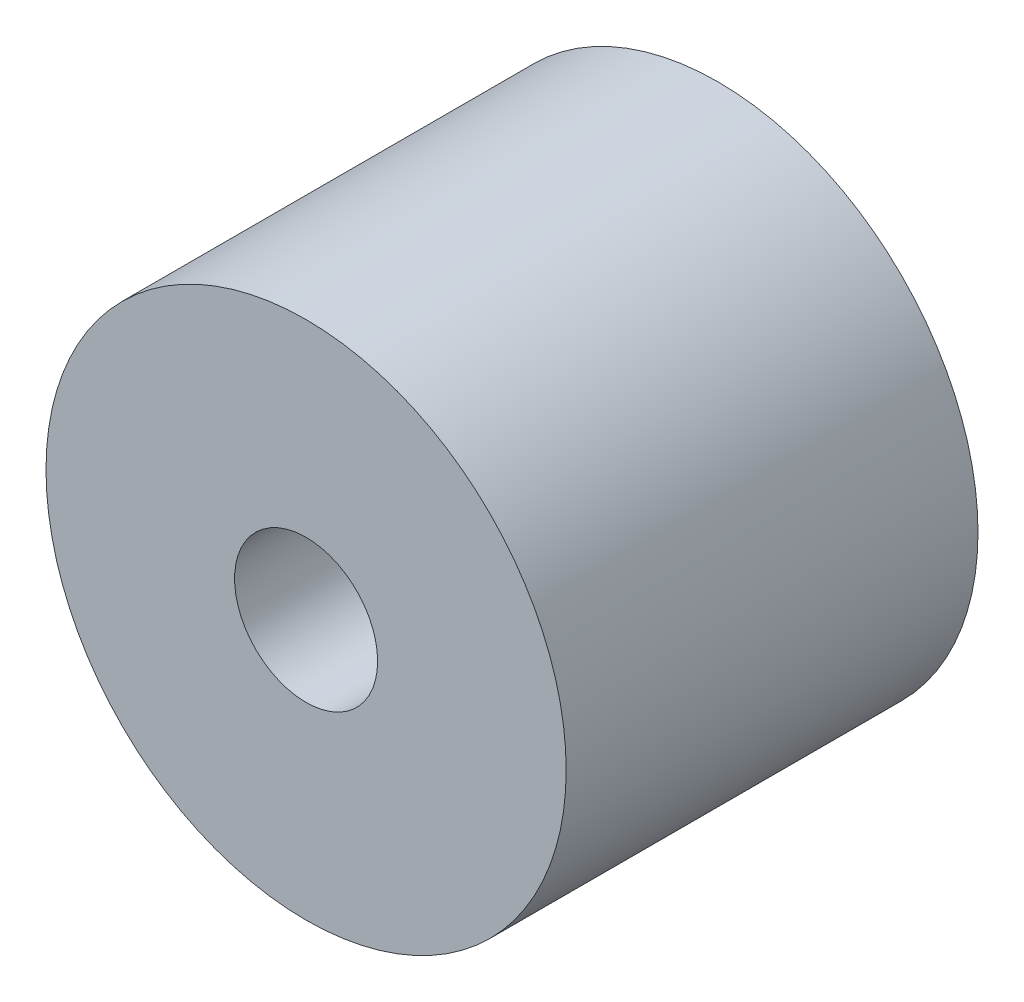
ISO-10303-21;
HEADER;
FILE_DESCRIPTION(('STEP AP214'),'2;1');
FILE_NAME('part.step','',(''),(''),'','','');
FILE_SCHEMA(('AUTOMOTIVE_DESIGN { 1 0 10303 214 1 1 1 1 }'));
ENDSEC;
DATA;
#1=APPLICATION_CONTEXT('core data for automotive mechanical design processes');
#2=APPLICATION_PROTOCOL_DEFINITION('international standard','automotive_design',2000,#1);
#3=PRODUCT_CONTEXT('',#1,'mechanical');
#4=PRODUCT('Part','Part','',(#3));
#5=PRODUCT_RELATED_PRODUCT_CATEGORY('part','',(#4));
#6=PRODUCT_DEFINITION_FORMATION('','',#4);
#7=PRODUCT_DEFINITION_CONTEXT('part definition',#1,'design');
#8=PRODUCT_DEFINITION('design','',#6,#7);
#9=PRODUCT_DEFINITION_SHAPE('','',#8);
#10=(LENGTH_UNIT() NAMED_UNIT(*) SI_UNIT(.MILLI.,.METRE.));
#11=(NAMED_UNIT(*) PLANE_ANGLE_UNIT() SI_UNIT($,.RADIAN.));
#12=(NAMED_UNIT(*) SI_UNIT($,.STERADIAN.) SOLID_ANGLE_UNIT());
#13=UNCERTAINTY_MEASURE_WITH_UNIT(LENGTH_MEASURE(1.E-05),#10,'distance_accuracy_value','');
#14=(GEOMETRIC_REPRESENTATION_CONTEXT(3) GLOBAL_UNCERTAINTY_ASSIGNED_CONTEXT((#13)) GLOBAL_UNIT_ASSIGNED_CONTEXT((#10,
#11,#12)) REPRESENTATION_CONTEXT('',''));
#15=CARTESIAN_POINT('',(0.,0.,0.));
#16=DIRECTION('',(0.,0.,1.));
#17=DIRECTION('',(1.,0.,0.));
#18=AXIS2_PLACEMENT_3D('',#15,#16,#17);
#19=CARTESIAN_POINT('',(0.,0.,9.5));
#20=DIRECTION('',(0.,0.,1.));
#21=DIRECTION('',(1.,0.,0.));
#22=AXIS2_PLACEMENT_3D('',#19,#20,#21);
#23=PLANE('',#22);
#24=CARTESIAN_POINT('',(0.,0.,9.5));
#25=DIRECTION('',(0.,0.,1.));
#26=DIRECTION('',(1.,0.,0.));
#27=AXIS2_PLACEMENT_3D('',#24,#25,#26);
#28=CIRCLE('',#27,6.);
#29=CARTESIAN_POINT('',(6.,0.,9.5));
#30=VERTEX_POINT('',#29);
#31=EDGE_CURVE('E10',#30,#30,#28,.T.);
#32=ORIENTED_EDGE('',*,*,#31,.T.);
#33=EDGE_LOOP('',(#32));
#34=FACE_BOUND('',#33,.T.);
#35=CARTESIAN_POINT('',(0.,0.,9.5));
#36=DIRECTION('',(0.,0.,1.));
#37=DIRECTION('',(1.,0.,0.));
#38=AXIS2_PLACEMENT_3D('',#35,#36,#37);
#39=CIRCLE('',#38,1.65);
#40=CARTESIAN_POINT('',(1.65,0.,9.5));
#41=VERTEX_POINT('',#40);
#42=EDGE_CURVE('E56',#41,#41,#39,.T.);
#43=ORIENTED_EDGE('',*,*,#42,.F.);
#44=EDGE_LOOP('',(#43));
#45=FACE_BOUND('',#44,.T.);
#46=ADVANCED_FACE('F43',(#34,#45),#23,.T.);
#47=CARTESIAN_POINT('',(0.,0.,0.));
#48=DIRECTION('',(0.,0.,1.));
#49=DIRECTION('',(1.,0.,0.));
#50=AXIS2_PLACEMENT_3D('',#47,#48,#49);
#51=PLANE('',#50);
#52=CARTESIAN_POINT('',(0.,0.,0.));
#53=DIRECTION('',(0.,0.,1.));
#54=DIRECTION('',(1.,0.,0.));
#55=AXIS2_PLACEMENT_3D('',#52,#53,#54);
#56=CIRCLE('',#55,6.);
#57=CARTESIAN_POINT('',(6.,0.,0.));
#58=VERTEX_POINT('',#57);
#59=EDGE_CURVE('E47',#58,#58,#56,.T.);
#60=ORIENTED_EDGE('',*,*,#59,.F.);
#61=EDGE_LOOP('',(#60));
#62=FACE_BOUND('',#61,.T.);
#63=CARTESIAN_POINT('',(0.,0.,0.));
#64=DIRECTION('',(0.,0.,1.));
#65=DIRECTION('',(1.,0.,0.));
#66=AXIS2_PLACEMENT_3D('',#63,#64,#65);
#67=CIRCLE('',#66,1.65);
#68=CARTESIAN_POINT('',(1.65,0.,0.));
#69=VERTEX_POINT('',#68);
#70=EDGE_CURVE('E58',#69,#69,#67,.T.);
#71=ORIENTED_EDGE('',*,*,#70,.T.);
#72=EDGE_LOOP('',(#71));
#73=FACE_BOUND('',#72,.T.);
#74=ADVANCED_FACE('F70',(#62,#73),#51,.F.);
#75=CARTESIAN_POINT('',(0.,0.,9.5));
#76=DIRECTION('',(0.,0.,-1.));
#77=DIRECTION('',(-1.,0.,0.));
#78=AXIS2_PLACEMENT_3D('',#75,#76,#77);
#79=CYLINDRICAL_SURFACE('',#78,6.);
#80=ORIENTED_EDGE('',*,*,#31,.F.);
#81=EDGE_LOOP('',(#80));
#82=FACE_BOUND('',#81,.T.);
#83=ORIENTED_EDGE('',*,*,#59,.T.);
#84=EDGE_LOOP('',(#83));
#85=FACE_BOUND('',#84,.T.);
#86=ADVANCED_FACE('F45',(#82,#85),#79,.T.);
#87=CARTESIAN_POINT('',(0.,0.,9.5));
#88=DIRECTION('',(0.,0.,-1.));
#89=DIRECTION('',(-1.,0.,0.));
#90=AXIS2_PLACEMENT_3D('',#87,#88,#89);
#91=CYLINDRICAL_SURFACE('',#90,1.65);
#92=ORIENTED_EDGE('',*,*,#42,.T.);
#93=EDGE_LOOP('',(#92));
#94=FACE_BOUND('',#93,.T.);
#95=ORIENTED_EDGE('',*,*,#70,.F.);
#96=EDGE_LOOP('',(#95));
#97=FACE_BOUND('',#96,.T.);
#98=ADVANCED_FACE('F66',(#94,#97),#91,.F.);
#99=CLOSED_SHELL('',(#46,#74,#86,#98));
#100=MANIFOLD_SOLID_BREP('B2',#99);
#101=ADVANCED_BREP_SHAPE_REPRESENTATION('',(#18,#100),#14);
#102=SHAPE_DEFINITION_REPRESENTATION(#9,#101);
ENDSEC;
END-ISO-10303-21;
